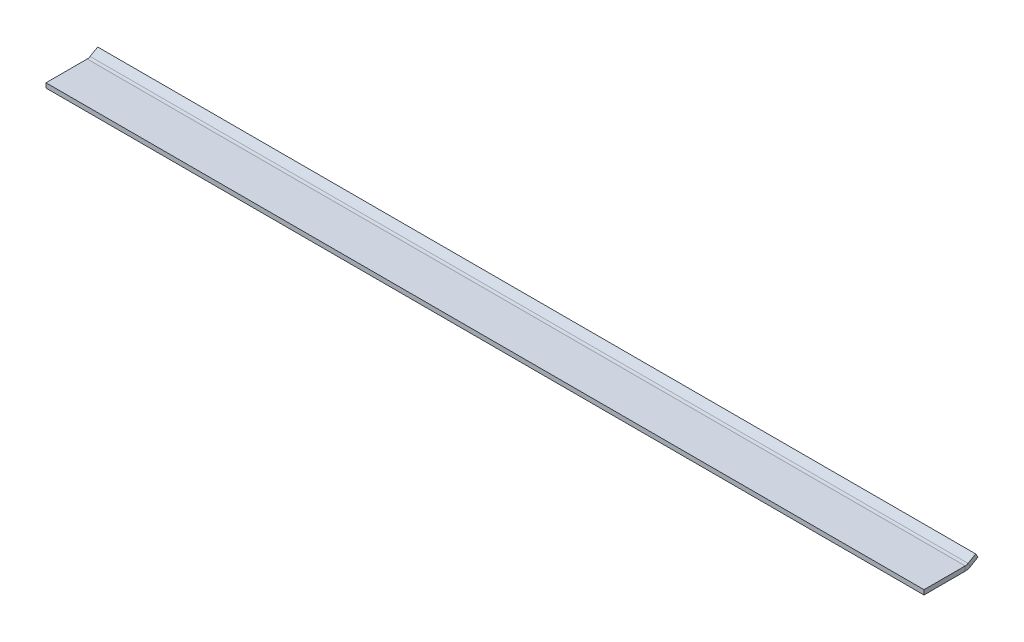
ISO-10303-21;
HEADER;
FILE_DESCRIPTION(('STEP AP214'),'2;1');
FILE_NAME('part.step','',(''),(''),'','','');
FILE_SCHEMA(('AUTOMOTIVE_DESIGN { 1 0 10303 214 1 1 1 1 }'));
ENDSEC;
DATA;
#1=APPLICATION_CONTEXT('core data for automotive mechanical design processes');
#2=APPLICATION_PROTOCOL_DEFINITION('international standard','automotive_design',2000,#1);
#3=PRODUCT_CONTEXT('',#1,'mechanical');
#4=PRODUCT('Part','Part','',(#3));
#5=PRODUCT_RELATED_PRODUCT_CATEGORY('part','',(#4));
#6=PRODUCT_DEFINITION_FORMATION('','',#4);
#7=PRODUCT_DEFINITION_CONTEXT('part definition',#1,'design');
#8=PRODUCT_DEFINITION('design','',#6,#7);
#9=PRODUCT_DEFINITION_SHAPE('','',#8);
#10=(LENGTH_UNIT() NAMED_UNIT(*) SI_UNIT(.MILLI.,.METRE.));
#11=(NAMED_UNIT(*) PLANE_ANGLE_UNIT() SI_UNIT($,.RADIAN.));
#12=(NAMED_UNIT(*) SI_UNIT($,.STERADIAN.) SOLID_ANGLE_UNIT());
#13=UNCERTAINTY_MEASURE_WITH_UNIT(LENGTH_MEASURE(1.E-05),#10,'distance_accuracy_value','');
#14=(GEOMETRIC_REPRESENTATION_CONTEXT(3) GLOBAL_UNCERTAINTY_ASSIGNED_CONTEXT((#13)) GLOBAL_UNIT_ASSIGNED_CONTEXT((#10,
#11,#12)) REPRESENTATION_CONTEXT('',''));
#15=CARTESIAN_POINT('',(0.,0.,0.));
#16=DIRECTION('',(0.,0.,1.));
#17=DIRECTION('',(1.,0.,0.));
#18=AXIS2_PLACEMENT_3D('',#15,#16,#17);
#19=CARTESIAN_POINT('',(-1140.,-12.,67.5));
#20=DIRECTION('',(-1.,0.,0.));
#21=DIRECTION('',(0.,0.,1.));
#22=AXIS2_PLACEMENT_3D('',#19,#20,#21);
#23=PLANE('',#22);
#24=DIRECTION('',(0.,0.,1.));
#25=VECTOR('',#24,1.);
#26=CARTESIAN_POINT('',(-1140.,0.,67.5));
#27=LINE('',#26,#25);
#28=CARTESIAN_POINT('',(-1140.,-1.23165366794353E-13,-39.480762113533));
#29=VERTEX_POINT('',#28);
#30=CARTESIAN_POINT('',(-1140.,0.,67.5));
#31=VERTEX_POINT('',#30);
#32=EDGE_CURVE('E110',#29,#31,#27,.T.);
#33=ORIENTED_EDGE('',*,*,#32,.F.);
#34=DIRECTION('',(0.,-1.,0.));
#35=VECTOR('',#34,1.);
#36=CARTESIAN_POINT('',(-1140.,-1.23165366794353E-13,-39.480762113533));
#37=LINE('',#36,#35);
#38=CARTESIAN_POINT('',(-1140.,-12.0000000000001,-39.480762113533));
#39=VERTEX_POINT('',#38);
#40=EDGE_CURVE('E129',#29,#39,#37,.T.);
#41=ORIENTED_EDGE('',*,*,#40,.T.);
#42=DIRECTION('',(0.,0.,1.));
#43=VECTOR('',#42,1.);
#44=CARTESIAN_POINT('',(-1140.,-12.,67.5));
#45=LINE('',#44,#43);
#46=CARTESIAN_POINT('',(-1140.,-12.,67.5));
#47=VERTEX_POINT('',#46);
#48=EDGE_CURVE('E121',#39,#47,#45,.T.);
#49=ORIENTED_EDGE('',*,*,#48,.T.);
#50=DIRECTION('',(0.,1.,0.));
#51=VECTOR('',#50,1.);
#52=CARTESIAN_POINT('',(-1140.,-12.,67.5));
#53=LINE('',#52,#51);
#54=EDGE_CURVE('E64',#47,#31,#53,.T.);
#55=ORIENTED_EDGE('',*,*,#54,.T.);
#56=EDGE_LOOP('',(#33,#41,#49,#55));
#57=FACE_BOUND('',#56,.T.);
#58=ADVANCED_FACE('F60',(#57),#23,.T.);
#59=CARTESIAN_POINT('',(0.,-12.,0.));
#60=DIRECTION('',(0.,-1.,0.));
#61=DIRECTION('',(0.,0.,-1.));
#62=AXIS2_PLACEMENT_3D('',#59,#60,#61);
#63=PLANE('',#62);
#64=ORIENTED_EDGE('',*,*,#48,.F.);
#65=DIRECTION('',(-1.,0.,0.));
#66=VECTOR('',#65,1.);
#67=CARTESIAN_POINT('',(-1140.,-12.0000000000001,-39.480762113533));
#68=LINE('',#67,#66);
#69=CARTESIAN_POINT('',(1140.,-12.,-39.480762113533));
#70=VERTEX_POINT('',#69);
#71=EDGE_CURVE('E152',#39,#70,#68,.F.);
#72=ORIENTED_EDGE('',*,*,#71,.T.);
#73=DIRECTION('',(0.,0.,-1.));
#74=VECTOR('',#73,1.);
#75=CARTESIAN_POINT('',(1140.,-12.,67.5));
#76=LINE('',#75,#74);
#77=CARTESIAN_POINT('',(1140.,-12.,67.5));
#78=VERTEX_POINT('',#77);
#79=EDGE_CURVE('E116',#78,#70,#76,.T.);
#80=ORIENTED_EDGE('',*,*,#79,.F.);
#81=DIRECTION('',(1.,0.,0.));
#82=VECTOR('',#81,1.);
#83=CARTESIAN_POINT('',(-1140.,-12.,67.5));
#84=LINE('',#83,#82);
#85=EDGE_CURVE('E101',#47,#78,#84,.T.);
#86=ORIENTED_EDGE('',*,*,#85,.F.);
#87=EDGE_LOOP('',(#64,#72,#80,#86));
#88=FACE_BOUND('',#87,.T.);
#89=ADVANCED_FACE('F263',(#88),#63,.T.);
#90=CARTESIAN_POINT('',(0.,0.,0.));
#91=DIRECTION('',(0.,-1.,0.));
#92=DIRECTION('',(0.,0.,-1.));
#93=AXIS2_PLACEMENT_3D('',#90,#91,#92);
#94=PLANE('',#93);
#95=DIRECTION('',(-1.,0.,0.));
#96=VECTOR('',#95,1.);
#97=CARTESIAN_POINT('',(-1140.,-1.23165366794353E-13,-39.480762113533));
#98=LINE('',#97,#96);
#99=CARTESIAN_POINT('',(1140.,0.,-39.480762113533));
#100=VERTEX_POINT('',#99);
#101=EDGE_CURVE('E139',#29,#100,#98,.F.);
#102=ORIENTED_EDGE('',*,*,#101,.F.);
#103=ORIENTED_EDGE('',*,*,#32,.T.);
#104=DIRECTION('',(1.,0.,0.));
#105=VECTOR('',#104,1.);
#106=CARTESIAN_POINT('',(-1140.,0.,67.5));
#107=LINE('',#106,#105);
#108=CARTESIAN_POINT('',(1140.,0.,67.5));
#109=VERTEX_POINT('',#108);
#110=EDGE_CURVE('E99',#31,#109,#107,.T.);
#111=ORIENTED_EDGE('',*,*,#110,.T.);
#112=DIRECTION('',(0.,0.,-1.));
#113=VECTOR('',#112,1.);
#114=CARTESIAN_POINT('',(1140.,0.,67.5));
#115=LINE('',#114,#113);
#116=EDGE_CURVE('E104',#109,#100,#115,.T.);
#117=ORIENTED_EDGE('',*,*,#116,.T.);
#118=EDGE_LOOP('',(#102,#103,#111,#117));
#119=FACE_BOUND('',#118,.T.);
#120=ADVANCED_FACE('F112',(#119),#94,.F.);
#121=CARTESIAN_POINT('',(1140.,-12.,67.5));
#122=DIRECTION('',(1.,0.,0.));
#123=DIRECTION('',(0.,0.,-1.));
#124=AXIS2_PLACEMENT_3D('',#121,#122,#123);
#125=PLANE('',#124);
#126=DIRECTION('',(0.,-1.,0.));
#127=VECTOR('',#126,1.);
#128=CARTESIAN_POINT('',(1140.,0.,-39.480762113533));
#129=LINE('',#128,#127);
#130=EDGE_CURVE('E106',#100,#70,#129,.T.);
#131=ORIENTED_EDGE('',*,*,#130,.F.);
#132=ORIENTED_EDGE('',*,*,#116,.F.);
#133=DIRECTION('',(0.,1.,0.));
#134=VECTOR('',#133,1.);
#135=CARTESIAN_POINT('',(1140.,-12.,67.5));
#136=LINE('',#135,#134);
#137=EDGE_CURVE('E13',#78,#109,#136,.T.);
#138=ORIENTED_EDGE('',*,*,#137,.F.);
#139=ORIENTED_EDGE('',*,*,#79,.T.);
#140=EDGE_LOOP('',(#131,#132,#138,#139));
#141=FACE_BOUND('',#140,.T.);
#142=ADVANCED_FACE('F62',(#141),#125,.T.);
#143=CARTESIAN_POINT('',(-1140.,-12.,67.5));
#144=DIRECTION('',(0.,0.,1.));
#145=DIRECTION('',(1.,0.,0.));
#146=AXIS2_PLACEMENT_3D('',#143,#144,#145);
#147=PLANE('',#146);
#148=ORIENTED_EDGE('',*,*,#110,.F.);
#149=ORIENTED_EDGE('',*,*,#54,.F.);
#150=ORIENTED_EDGE('',*,*,#85,.T.);
#151=ORIENTED_EDGE('',*,*,#137,.T.);
#152=EDGE_LOOP('',(#148,#149,#150,#151));
#153=FACE_BOUND('',#152,.T.);
#154=ADVANCED_FACE('F96',(#153),#147,.T.);
#155=CARTESIAN_POINT('',(1140.,15.0000000000001,-39.480762113533));
#156=DIRECTION('',(1.,0.,0.));
#157=DIRECTION('',(0.,1.,0.));
#158=AXIS2_PLACEMENT_3D('',#155,#156,#157);
#159=PLANE('',#158);
#160=DIRECTION('',(0.,0.866025403784442,0.499999999999995));
#161=VECTOR('',#160,1.);
#162=CARTESIAN_POINT('',(1140.,-8.38268590217993,-52.9807621135328));
#163=LINE('',#162,#161);
#164=CARTESIAN_POINT('',(1140.,2.00961894323339,-46.9807621135329));
#165=VERTEX_POINT('',#164);
#166=CARTESIAN_POINT('',(1140.,-8.38268590217991,-52.9807621135329));
#167=VERTEX_POINT('',#166);
#168=EDGE_CURVE('E158',#165,#167,#163,.F.);
#169=ORIENTED_EDGE('',*,*,#168,.F.);
#170=CARTESIAN_POINT('',(1140.,15.0000000000001,-39.480762113533));
#171=DIRECTION('',(-1.,0.,0.));
#172=DIRECTION('',(0.,-1.,0.));
#173=AXIS2_PLACEMENT_3D('',#170,#171,#172);
#174=CIRCLE('',#173,15.0000000000001);
#175=EDGE_CURVE('E144',#100,#165,#174,.F.);
#176=ORIENTED_EDGE('',*,*,#175,.F.);
#177=ORIENTED_EDGE('',*,*,#130,.T.);
#178=CARTESIAN_POINT('',(1140.,15.0000000000001,-39.480762113533));
#179=DIRECTION('',(-1.,0.,0.));
#180=DIRECTION('',(0.,-1.,0.));
#181=AXIS2_PLACEMENT_3D('',#178,#179,#180);
#182=CIRCLE('',#181,27.0000000000001);
#183=EDGE_CURVE('E76',#70,#167,#182,.F.);
#184=ORIENTED_EDGE('',*,*,#183,.T.);
#185=EDGE_LOOP('',(#169,#176,#177,#184));
#186=FACE_BOUND('',#185,.T.);
#187=ADVANCED_FACE('F265',(#186),#159,.T.);
#188=CARTESIAN_POINT('',(-1140.,14.9999999999999,-39.480762113533));
#189=DIRECTION('',(1.,0.,0.));
#190=DIRECTION('',(0.,1.,0.));
#191=AXIS2_PLACEMENT_3D('',#188,#189,#190);
#192=PLANE('',#191);
#193=CARTESIAN_POINT('',(-1140.,14.9999999999999,-39.480762113533));
#194=DIRECTION('',(-1.,0.,0.));
#195=DIRECTION('',(0.,-1.,0.));
#196=AXIS2_PLACEMENT_3D('',#193,#194,#195);
#197=CIRCLE('',#196,15.0000000000001);
#198=CARTESIAN_POINT('',(-1140.,2.00961894323326,-46.9807621135329));
#199=VERTEX_POINT('',#198);
#200=EDGE_CURVE('E135',#199,#29,#197,.T.);
#201=ORIENTED_EDGE('',*,*,#200,.F.);
#202=DIRECTION('',(0.,0.866025403784442,0.499999999999995));
#203=VECTOR('',#202,1.);
#204=CARTESIAN_POINT('',(-1140.,2.00961894323338,-46.9807621135329));
#205=LINE('',#204,#203);
#206=CARTESIAN_POINT('',(-1140.,-8.38268590217993,-52.9807621135328));
#207=VERTEX_POINT('',#206);
#208=EDGE_CURVE('E166',#199,#207,#205,.F.);
#209=ORIENTED_EDGE('',*,*,#208,.T.);
#210=CARTESIAN_POINT('',(-1140.,14.9999999999999,-39.480762113533));
#211=DIRECTION('',(-1.,0.,0.));
#212=DIRECTION('',(0.,-1.,0.));
#213=AXIS2_PLACEMENT_3D('',#210,#211,#212);
#214=CIRCLE('',#213,27.0000000000001);
#215=EDGE_CURVE('E148',#207,#39,#214,.T.);
#216=ORIENTED_EDGE('',*,*,#215,.T.);
#217=ORIENTED_EDGE('',*,*,#40,.F.);
#218=EDGE_LOOP('',(#201,#209,#216,#217));
#219=FACE_BOUND('',#218,.T.);
#220=ADVANCED_FACE('F251',(#219),#192,.F.);
#221=CARTESIAN_POINT('',(-1140.,14.9999999999999,-39.480762113533));
#222=DIRECTION('',(-1.,0.,0.));
#223=DIRECTION('',(0.,-0.866025403784442,-0.499999999999995));
#224=AXIS2_PLACEMENT_3D('',#221,#222,#223);
#225=CYLINDRICAL_SURFACE('',#224,27.0000000000001);
#226=ORIENTED_EDGE('',*,*,#71,.F.);
#227=ORIENTED_EDGE('',*,*,#215,.F.);
#228=DIRECTION('',(-1.,0.,0.));
#229=VECTOR('',#228,1.);
#230=CARTESIAN_POINT('',(1140.,-8.38268590217993,-52.9807621135328));
#231=LINE('',#230,#229);
#232=EDGE_CURVE('E170',#207,#167,#231,.F.);
#233=ORIENTED_EDGE('',*,*,#232,.T.);
#234=ORIENTED_EDGE('',*,*,#183,.F.);
#235=EDGE_LOOP('',(#226,#227,#233,#234));
#236=FACE_BOUND('',#235,.T.);
#237=ADVANCED_FACE('F264',(#236),#225,.T.);
#238=CARTESIAN_POINT('',(-1140.,14.9999999999999,-39.480762113533));
#239=DIRECTION('',(-1.,0.,0.));
#240=DIRECTION('',(0.,-0.866025403784442,-0.499999999999995));
#241=AXIS2_PLACEMENT_3D('',#238,#239,#240);
#242=CYLINDRICAL_SURFACE('',#241,15.0000000000001);
#243=ORIENTED_EDGE('',*,*,#101,.T.);
#244=ORIENTED_EDGE('',*,*,#175,.T.);
#245=DIRECTION('',(-1.,0.,0.));
#246=VECTOR('',#245,1.);
#247=CARTESIAN_POINT('',(1140.,2.00961894323338,-46.9807621135329));
#248=LINE('',#247,#246);
#249=EDGE_CURVE('E162',#165,#199,#248,.T.);
#250=ORIENTED_EDGE('',*,*,#249,.T.);
#251=ORIENTED_EDGE('',*,*,#200,.T.);
#252=EDGE_LOOP('',(#243,#244,#250,#251));
#253=FACE_BOUND('',#252,.T.);
#254=ADVANCED_FACE('F253',(#253),#242,.F.);
#255=CARTESIAN_POINT('',(1140.,-10.3923048454133,-49.4999999999997));
#256=DIRECTION('',(-1.,0.,0.));
#257=DIRECTION('',(0.,0.,1.));
#258=AXIS2_PLACEMENT_3D('',#255,#256,#257);
#259=PLANE('',#258);
#260=ORIENTED_EDGE('',*,*,#168,.T.);
#261=DIRECTION('',(0.,-0.499999999999995,0.866025403784442));
#262=VECTOR('',#261,1.);
#263=CARTESIAN_POINT('',(1140.,-39.6206622231426,1.12500000000883));
#264=LINE('',#263,#262);
#265=CARTESIAN_POINT('',(1140.,2.99999999999984,-72.6961524227064));
#266=VERTEX_POINT('',#265);
#267=EDGE_CURVE('E185',#266,#167,#264,.T.);
#268=ORIENTED_EDGE('',*,*,#267,.F.);
#269=DIRECTION('',(0.,0.866025403784442,0.499999999999995));
#270=VECTOR('',#269,1.);
#271=CARTESIAN_POINT('',(1140.,2.99999999999985,-72.6961524227064));
#272=LINE('',#271,#270);
#273=CARTESIAN_POINT('',(1140.,13.3923048454131,-66.6961524227065));
#274=VERTEX_POINT('',#273);
#275=EDGE_CURVE('E197',#266,#274,#272,.T.);
#276=ORIENTED_EDGE('',*,*,#275,.T.);
#277=DIRECTION('',(0.,0.499999999999995,-0.866025403784442));
#278=VECTOR('',#277,1.);
#279=CARTESIAN_POINT('',(1140.,0.,-43.4999999999998));
#280=LINE('',#279,#278);
#281=EDGE_CURVE('E173',#274,#165,#280,.F.);
#282=ORIENTED_EDGE('',*,*,#281,.T.);
#283=EDGE_LOOP('',(#260,#268,#276,#282));
#284=FACE_BOUND('',#283,.T.);
#285=ADVANCED_FACE('F226',(#284),#259,.F.);
#286=CARTESIAN_POINT('',(-1140.,2.99999999999985,-72.6961524227064));
#287=DIRECTION('',(1.,0.,0.));
#288=DIRECTION('',(0.,0.,-1.));
#289=AXIS2_PLACEMENT_3D('',#286,#287,#288);
#290=PLANE('',#289);
#291=ORIENTED_EDGE('',*,*,#208,.F.);
#292=DIRECTION('',(0.,-0.499999999999995,0.866025403784442));
#293=VECTOR('',#292,1.);
#294=CARTESIAN_POINT('',(-1140.,13.3923048454131,-66.6961524227065));
#295=LINE('',#294,#293);
#296=CARTESIAN_POINT('',(-1140.,13.3923048454131,-66.6961524227065));
#297=VERTEX_POINT('',#296);
#298=EDGE_CURVE('E177',#199,#297,#295,.F.);
#299=ORIENTED_EDGE('',*,*,#298,.T.);
#300=DIRECTION('',(0.,0.866025403784442,0.499999999999995));
#301=VECTOR('',#300,1.);
#302=CARTESIAN_POINT('',(-1140.,2.99999999999985,-72.6961524227064));
#303=LINE('',#302,#301);
#304=CARTESIAN_POINT('',(-1140.,2.99999999999984,-72.6961524227064));
#305=VERTEX_POINT('',#304);
#306=EDGE_CURVE('E140',#305,#297,#303,.T.);
#307=ORIENTED_EDGE('',*,*,#306,.F.);
#308=DIRECTION('',(0.,0.499999999999995,-0.866025403784442));
#309=VECTOR('',#308,1.);
#310=CARTESIAN_POINT('',(-1140.,-39.6206622231332,1.12499999999246));
#311=LINE('',#310,#309);
#312=EDGE_CURVE('E189',#207,#305,#311,.T.);
#313=ORIENTED_EDGE('',*,*,#312,.F.);
#314=EDGE_LOOP('',(#291,#299,#307,#313));
#315=FACE_BOUND('',#314,.T.);
#316=ADVANCED_FACE('F248',(#315),#290,.F.);
#317=CARTESIAN_POINT('',(0.,-39.6206622231379,1.12500000000064));
#318=DIRECTION('',(0.,0.866025403784442,0.499999999999995));
#319=DIRECTION('',(0.,-0.499999999999995,0.866025403784442));
#320=AXIS2_PLACEMENT_3D('',#317,#318,#319);
#321=PLANE('',#320);
#322=ORIENTED_EDGE('',*,*,#232,.F.);
#323=ORIENTED_EDGE('',*,*,#312,.T.);
#324=DIRECTION('',(1.,0.,0.));
#325=VECTOR('',#324,1.);
#326=CARTESIAN_POINT('',(0.,2.99999999999984,-72.6961524227064));
#327=LINE('',#326,#325);
#328=EDGE_CURVE('E193',#305,#266,#327,.T.);
#329=ORIENTED_EDGE('',*,*,#328,.T.);
#330=ORIENTED_EDGE('',*,*,#267,.T.);
#331=EDGE_LOOP('',(#322,#323,#329,#330));
#332=FACE_BOUND('',#331,.T.);
#333=ADVANCED_FACE('F246',(#332),#321,.F.);
#334=CARTESIAN_POINT('',(0.,-29.2283573777246,7.12500000000058));
#335=DIRECTION('',(0.,0.866025403784442,0.499999999999995));
#336=DIRECTION('',(0.,-0.499999999999995,0.866025403784442));
#337=AXIS2_PLACEMENT_3D('',#334,#335,#336);
#338=PLANE('',#337);
#339=ORIENTED_EDGE('',*,*,#298,.F.);
#340=ORIENTED_EDGE('',*,*,#249,.F.);
#341=ORIENTED_EDGE('',*,*,#281,.F.);
#342=DIRECTION('',(-1.,0.,0.));
#343=VECTOR('',#342,1.);
#344=CARTESIAN_POINT('',(1140.,13.3923048454131,-66.6961524227065));
#345=LINE('',#344,#343);
#346=EDGE_CURVE('E181',#297,#274,#345,.F.);
#347=ORIENTED_EDGE('',*,*,#346,.F.);
#348=EDGE_LOOP('',(#339,#340,#341,#347));
#349=FACE_BOUND('',#348,.T.);
#350=ADVANCED_FACE('F220',(#349),#338,.T.);
#351=CARTESIAN_POINT('',(1140.,2.99999999999985,-72.6961524227064));
#352=DIRECTION('',(0.,-0.499999999999995,0.866025403784441));
#353=DIRECTION('',(0.,-0.866025403784442,-0.499999999999995));
#354=AXIS2_PLACEMENT_3D('',#351,#352,#353);
#355=PLANE('',#354);
#356=ORIENTED_EDGE('',*,*,#346,.T.);
#357=ORIENTED_EDGE('',*,*,#275,.F.);
#358=ORIENTED_EDGE('',*,*,#328,.F.);
#359=ORIENTED_EDGE('',*,*,#306,.T.);
#360=EDGE_LOOP('',(#356,#357,#358,#359));
#361=FACE_BOUND('',#360,.T.);
#362=ADVANCED_FACE('F209',(#361),#355,.F.);
#363=CLOSED_SHELL('',(#58,#89,#120,#142,#154,#187,#220,#237,#254,#285,#316,#333,#350,#362));
#364=MANIFOLD_SOLID_BREP('B2',#363);
#365=ADVANCED_BREP_SHAPE_REPRESENTATION('',(#18,#364),#14);
#366=SHAPE_DEFINITION_REPRESENTATION(#9,#365);
ENDSEC;
END-ISO-10303-21;
